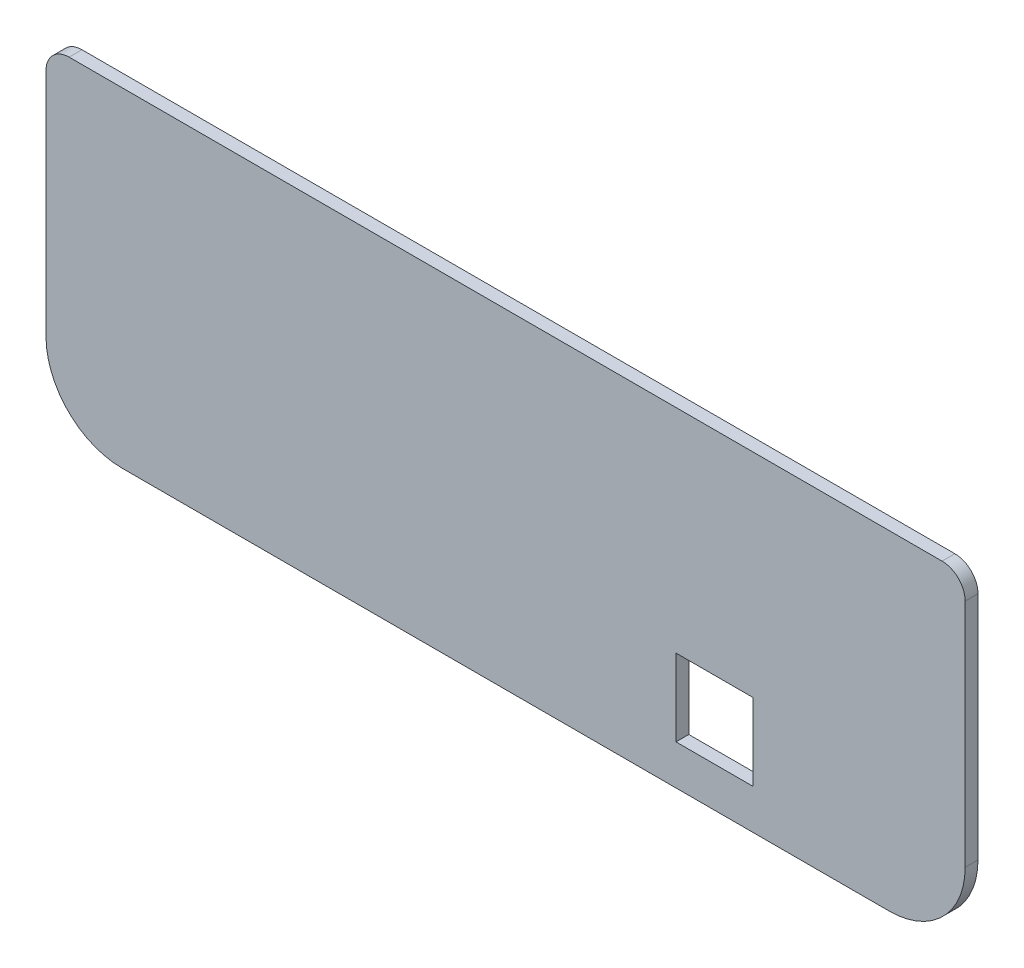
ISO-10303-21;
HEADER;
FILE_DESCRIPTION(('STEP AP214'),'2;1');
FILE_NAME('part.step','',(''),(''),'','','');
FILE_SCHEMA(('AUTOMOTIVE_DESIGN { 1 0 10303 214 1 1 1 1 }'));
ENDSEC;
DATA;
#1=APPLICATION_CONTEXT('core data for automotive mechanical design processes');
#2=APPLICATION_PROTOCOL_DEFINITION('international standard','automotive_design',2000,#1);
#3=PRODUCT_CONTEXT('',#1,'mechanical');
#4=PRODUCT('Part','Part','',(#3));
#5=PRODUCT_RELATED_PRODUCT_CATEGORY('part','',(#4));
#6=PRODUCT_DEFINITION_FORMATION('','',#4);
#7=PRODUCT_DEFINITION_CONTEXT('part definition',#1,'design');
#8=PRODUCT_DEFINITION('design','',#6,#7);
#9=PRODUCT_DEFINITION_SHAPE('','',#8);
#10=(LENGTH_UNIT() NAMED_UNIT(*) SI_UNIT(.MILLI.,.METRE.));
#11=(NAMED_UNIT(*) PLANE_ANGLE_UNIT() SI_UNIT($,.RADIAN.));
#12=(NAMED_UNIT(*) SI_UNIT($,.STERADIAN.) SOLID_ANGLE_UNIT());
#13=UNCERTAINTY_MEASURE_WITH_UNIT(LENGTH_MEASURE(1.E-05),#10,'distance_accuracy_value','');
#14=(GEOMETRIC_REPRESENTATION_CONTEXT(3) GLOBAL_UNCERTAINTY_ASSIGNED_CONTEXT((#13)) GLOBAL_UNIT_ASSIGNED_CONTEXT((#10,
#11,#12)) REPRESENTATION_CONTEXT('',''));
#15=CARTESIAN_POINT('',(0.,0.,0.));
#16=DIRECTION('',(0.,0.,1.));
#17=DIRECTION('',(1.,0.,0.));
#18=AXIS2_PLACEMENT_3D('',#15,#16,#17);
#19=CARTESIAN_POINT('',(4.5,57.73,2.5));
#20=DIRECTION('',(0.,0.,-1.));
#21=DIRECTION('',(-1.,0.,0.));
#22=AXIS2_PLACEMENT_3D('',#19,#20,#21);
#23=CYLINDRICAL_SURFACE('',#22,4.5);
#24=CARTESIAN_POINT('',(4.5,57.73,0.));
#25=DIRECTION('',(0.,0.,1.));
#26=DIRECTION('',(-1.,0.,0.));
#27=AXIS2_PLACEMENT_3D('',#24,#25,#26);
#28=CIRCLE('',#27,4.5);
#29=CARTESIAN_POINT('',(4.50000000000003,62.23,0.));
#30=VERTEX_POINT('',#29);
#31=CARTESIAN_POINT('',(0.,57.73,0.));
#32=VERTEX_POINT('',#31);
#33=EDGE_CURVE('E157',#30,#32,#28,.T.);
#34=ORIENTED_EDGE('',*,*,#33,.T.);
#35=DIRECTION('',(0.,0.,-1.));
#36=VECTOR('',#35,1.);
#37=CARTESIAN_POINT('',(0.,57.73,2.5));
#38=LINE('',#37,#36);
#39=CARTESIAN_POINT('',(0.,57.73,2.5));
#40=VERTEX_POINT('',#39);
#41=EDGE_CURVE('E11',#40,#32,#38,.T.);
#42=ORIENTED_EDGE('',*,*,#41,.F.);
#43=CARTESIAN_POINT('',(4.5,57.73,2.5));
#44=DIRECTION('',(0.,0.,1.));
#45=DIRECTION('',(-1.,0.,0.));
#46=AXIS2_PLACEMENT_3D('',#43,#44,#45);
#47=CIRCLE('',#46,4.5);
#48=CARTESIAN_POINT('',(4.50000000000003,62.23,2.5));
#49=VERTEX_POINT('',#48);
#50=EDGE_CURVE('E158',#49,#40,#47,.T.);
#51=ORIENTED_EDGE('',*,*,#50,.F.);
#52=DIRECTION('',(0.,0.,-1.));
#53=VECTOR('',#52,1.);
#54=CARTESIAN_POINT('',(4.50000000000003,62.23,2.5));
#55=LINE('',#54,#53);
#56=EDGE_CURVE('E176',#49,#30,#55,.T.);
#57=ORIENTED_EDGE('',*,*,#56,.T.);
#58=EDGE_LOOP('',(#34,#42,#51,#57));
#59=FACE_BOUND('',#58,.T.);
#60=ADVANCED_FACE('F32',(#59),#23,.T.);
#61=CARTESIAN_POINT('',(0.,12.8,2.5));
#62=DIRECTION('',(1.,0.,0.));
#63=DIRECTION('',(0.,0.,-1.));
#64=AXIS2_PLACEMENT_3D('',#61,#62,#63);
#65=PLANE('',#64);
#66=DIRECTION('',(0.,-1.,0.));
#67=VECTOR('',#66,1.);
#68=CARTESIAN_POINT('',(0.,12.8,0.));
#69=LINE('',#68,#67);
#70=CARTESIAN_POINT('',(0.,12.8,0.));
#71=VERTEX_POINT('',#70);
#72=EDGE_CURVE('E179',#32,#71,#69,.T.);
#73=ORIENTED_EDGE('',*,*,#72,.T.);
#74=DIRECTION('',(0.,0.,-1.));
#75=VECTOR('',#74,1.);
#76=CARTESIAN_POINT('',(0.,12.8,2.5));
#77=LINE('',#76,#75);
#78=CARTESIAN_POINT('',(0.,12.8,2.5));
#79=VERTEX_POINT('',#78);
#80=EDGE_CURVE('E39',#79,#71,#77,.T.);
#81=ORIENTED_EDGE('',*,*,#80,.F.);
#82=DIRECTION('',(0.,-1.,0.));
#83=VECTOR('',#82,1.);
#84=CARTESIAN_POINT('',(0.,12.8,2.5));
#85=LINE('',#84,#83);
#86=EDGE_CURVE('E161',#40,#79,#85,.T.);
#87=ORIENTED_EDGE('',*,*,#86,.F.);
#88=ORIENTED_EDGE('',*,*,#41,.T.);
#89=EDGE_LOOP('',(#73,#81,#87,#88));
#90=FACE_BOUND('',#89,.T.);
#91=ADVANCED_FACE('F234',(#90),#65,.F.);
#92=CARTESIAN_POINT('',(14.8,12.8,2.5));
#93=DIRECTION('',(0.,0.,-1.));
#94=DIRECTION('',(-1.,0.,0.));
#95=AXIS2_PLACEMENT_3D('',#92,#93,#94);
#96=CYLINDRICAL_SURFACE('',#95,14.8);
#97=CARTESIAN_POINT('',(14.8,12.8,0.));
#98=DIRECTION('',(0.,0.,1.));
#99=DIRECTION('',(-1.,0.,0.));
#100=AXIS2_PLACEMENT_3D('',#97,#98,#99);
#101=CIRCLE('',#100,14.8);
#102=CARTESIAN_POINT('',(14.8,-2.00000000000001,0.));
#103=VERTEX_POINT('',#102);
#104=EDGE_CURVE('E181',#71,#103,#101,.T.);
#105=ORIENTED_EDGE('',*,*,#104,.T.);
#106=DIRECTION('',(0.,0.,-1.));
#107=VECTOR('',#106,1.);
#108=CARTESIAN_POINT('',(14.8,-2.00000000000001,2.5));
#109=LINE('',#108,#107);
#110=CARTESIAN_POINT('',(14.8,-2.00000000000001,2.5));
#111=VERTEX_POINT('',#110);
#112=EDGE_CURVE('E206',#111,#103,#109,.T.);
#113=ORIENTED_EDGE('',*,*,#112,.F.);
#114=CARTESIAN_POINT('',(14.8,12.8,2.5));
#115=DIRECTION('',(0.,0.,1.));
#116=DIRECTION('',(-1.,0.,0.));
#117=AXIS2_PLACEMENT_3D('',#114,#115,#116);
#118=CIRCLE('',#117,14.8);
#119=EDGE_CURVE('E164',#79,#111,#118,.T.);
#120=ORIENTED_EDGE('',*,*,#119,.F.);
#121=ORIENTED_EDGE('',*,*,#80,.T.);
#122=EDGE_LOOP('',(#105,#113,#120,#121));
#123=FACE_BOUND('',#122,.T.);
#124=ADVANCED_FACE('F213',(#123),#96,.T.);
#125=CARTESIAN_POINT('',(14.8,-2.00000000000001,2.5));
#126=DIRECTION('',(0.,1.,0.));
#127=DIRECTION('',(0.,0.,1.));
#128=AXIS2_PLACEMENT_3D('',#125,#126,#127);
#129=PLANE('',#128);
#130=DIRECTION('',(1.,0.,0.));
#131=VECTOR('',#130,1.);
#132=CARTESIAN_POINT('',(14.8,-2.00000000000001,0.));
#133=LINE('',#132,#131);
#134=CARTESIAN_POINT('',(164.37,-2.00000000000001,0.));
#135=VERTEX_POINT('',#134);
#136=EDGE_CURVE('E183',#103,#135,#133,.T.);
#137=ORIENTED_EDGE('',*,*,#136,.T.);
#138=DIRECTION('',(0.,0.,-1.));
#139=VECTOR('',#138,1.);
#140=CARTESIAN_POINT('',(164.37,-2.00000000000001,2.5));
#141=LINE('',#140,#139);
#142=CARTESIAN_POINT('',(164.37,-2.00000000000001,2.5));
#143=VERTEX_POINT('',#142);
#144=EDGE_CURVE('E203',#143,#135,#141,.T.);
#145=ORIENTED_EDGE('',*,*,#144,.F.);
#146=DIRECTION('',(1.,0.,0.));
#147=VECTOR('',#146,1.);
#148=CARTESIAN_POINT('',(14.8,-2.00000000000001,2.5));
#149=LINE('',#148,#147);
#150=EDGE_CURVE('E166',#111,#143,#149,.T.);
#151=ORIENTED_EDGE('',*,*,#150,.F.);
#152=ORIENTED_EDGE('',*,*,#112,.T.);
#153=EDGE_LOOP('',(#137,#145,#151,#152));
#154=FACE_BOUND('',#153,.T.);
#155=ADVANCED_FACE('F222',(#154),#129,.F.);
#156=CARTESIAN_POINT('',(164.37,12.8,2.5));
#157=DIRECTION('',(0.,0.,-1.));
#158=DIRECTION('',(-1.,0.,0.));
#159=AXIS2_PLACEMENT_3D('',#156,#157,#158);
#160=CYLINDRICAL_SURFACE('',#159,14.8);
#161=CARTESIAN_POINT('',(164.37,12.8,0.));
#162=DIRECTION('',(0.,0.,1.));
#163=DIRECTION('',(1.,0.,0.));
#164=AXIS2_PLACEMENT_3D('',#161,#162,#163);
#165=CIRCLE('',#164,14.8);
#166=CARTESIAN_POINT('',(179.17,12.8,0.));
#167=VERTEX_POINT('',#166);
#168=EDGE_CURVE('E185',#135,#167,#165,.T.);
#169=ORIENTED_EDGE('',*,*,#168,.T.);
#170=DIRECTION('',(0.,0.,-1.));
#171=VECTOR('',#170,1.);
#172=CARTESIAN_POINT('',(179.17,12.8,2.5));
#173=LINE('',#172,#171);
#174=CARTESIAN_POINT('',(179.17,12.8,2.5));
#175=VERTEX_POINT('',#174);
#176=EDGE_CURVE('E200',#175,#167,#173,.T.);
#177=ORIENTED_EDGE('',*,*,#176,.F.);
#178=CARTESIAN_POINT('',(164.37,12.8,2.5));
#179=DIRECTION('',(0.,0.,1.));
#180=DIRECTION('',(1.,0.,0.));
#181=AXIS2_PLACEMENT_3D('',#178,#179,#180);
#182=CIRCLE('',#181,14.8);
#183=EDGE_CURVE('E168',#143,#175,#182,.T.);
#184=ORIENTED_EDGE('',*,*,#183,.F.);
#185=ORIENTED_EDGE('',*,*,#144,.T.);
#186=EDGE_LOOP('',(#169,#177,#184,#185));
#187=FACE_BOUND('',#186,.T.);
#188=ADVANCED_FACE('F226',(#187),#160,.T.);
#189=CARTESIAN_POINT('',(179.17,12.8,2.5));
#190=DIRECTION('',(-1.,0.,0.));
#191=DIRECTION('',(0.,0.,1.));
#192=AXIS2_PLACEMENT_3D('',#189,#190,#191);
#193=PLANE('',#192);
#194=DIRECTION('',(0.,1.,0.));
#195=VECTOR('',#194,1.);
#196=CARTESIAN_POINT('',(179.17,12.8,0.));
#197=LINE('',#196,#195);
#198=CARTESIAN_POINT('',(179.17,57.73,0.));
#199=VERTEX_POINT('',#198);
#200=EDGE_CURVE('E187',#167,#199,#197,.T.);
#201=ORIENTED_EDGE('',*,*,#200,.T.);
#202=DIRECTION('',(0.,0.,-1.));
#203=VECTOR('',#202,1.);
#204=CARTESIAN_POINT('',(179.17,57.73,2.5));
#205=LINE('',#204,#203);
#206=CARTESIAN_POINT('',(179.17,57.73,2.5));
#207=VERTEX_POINT('',#206);
#208=EDGE_CURVE('E197',#207,#199,#205,.T.);
#209=ORIENTED_EDGE('',*,*,#208,.F.);
#210=DIRECTION('',(0.,1.,0.));
#211=VECTOR('',#210,1.);
#212=CARTESIAN_POINT('',(179.17,12.8,2.5));
#213=LINE('',#212,#211);
#214=EDGE_CURVE('E170',#175,#207,#213,.T.);
#215=ORIENTED_EDGE('',*,*,#214,.F.);
#216=ORIENTED_EDGE('',*,*,#176,.T.);
#217=EDGE_LOOP('',(#201,#209,#215,#216));
#218=FACE_BOUND('',#217,.T.);
#219=ADVANCED_FACE('F247',(#218),#193,.F.);
#220=CARTESIAN_POINT('',(174.67,57.73,2.5));
#221=DIRECTION('',(0.,0.,-1.));
#222=DIRECTION('',(-1.,0.,0.));
#223=AXIS2_PLACEMENT_3D('',#220,#221,#222);
#224=CYLINDRICAL_SURFACE('',#223,4.50000000000001);
#225=CARTESIAN_POINT('',(174.67,57.73,0.));
#226=DIRECTION('',(0.,0.,1.));
#227=DIRECTION('',(-1.,0.,0.));
#228=AXIS2_PLACEMENT_3D('',#225,#226,#227);
#229=CIRCLE('',#228,4.50000000000001);
#230=CARTESIAN_POINT('',(174.67,62.23,0.));
#231=VERTEX_POINT('',#230);
#232=EDGE_CURVE('E189',#199,#231,#229,.T.);
#233=ORIENTED_EDGE('',*,*,#232,.T.);
#234=DIRECTION('',(0.,0.,-1.));
#235=VECTOR('',#234,1.);
#236=CARTESIAN_POINT('',(174.67,62.23,2.5));
#237=LINE('',#236,#235);
#238=CARTESIAN_POINT('',(174.67,62.23,2.5));
#239=VERTEX_POINT('',#238);
#240=EDGE_CURVE('E194',#239,#231,#237,.T.);
#241=ORIENTED_EDGE('',*,*,#240,.F.);
#242=CARTESIAN_POINT('',(174.67,57.73,2.5));
#243=DIRECTION('',(0.,0.,1.));
#244=DIRECTION('',(-1.,0.,0.));
#245=AXIS2_PLACEMENT_3D('',#242,#243,#244);
#246=CIRCLE('',#245,4.50000000000001);
#247=EDGE_CURVE('E172',#207,#239,#246,.T.);
#248=ORIENTED_EDGE('',*,*,#247,.F.);
#249=ORIENTED_EDGE('',*,*,#208,.T.);
#250=EDGE_LOOP('',(#233,#241,#248,#249));
#251=FACE_BOUND('',#250,.T.);
#252=ADVANCED_FACE('F245',(#251),#224,.T.);
#253=CARTESIAN_POINT('',(4.50000000000003,62.23,2.5));
#254=DIRECTION('',(0.,-1.,0.));
#255=DIRECTION('',(0.,0.,-1.));
#256=AXIS2_PLACEMENT_3D('',#253,#254,#255);
#257=PLANE('',#256);
#258=DIRECTION('',(-1.,0.,0.));
#259=VECTOR('',#258,1.);
#260=CARTESIAN_POINT('',(4.50000000000003,62.23,0.));
#261=LINE('',#260,#259);
#262=EDGE_CURVE('E162',#231,#30,#261,.T.);
#263=ORIENTED_EDGE('',*,*,#262,.T.);
#264=ORIENTED_EDGE('',*,*,#56,.F.);
#265=DIRECTION('',(-1.,0.,0.));
#266=VECTOR('',#265,1.);
#267=CARTESIAN_POINT('',(4.50000000000003,62.23,2.5));
#268=LINE('',#267,#266);
#269=EDGE_CURVE('E174',#239,#49,#268,.T.);
#270=ORIENTED_EDGE('',*,*,#269,.F.);
#271=ORIENTED_EDGE('',*,*,#240,.T.);
#272=EDGE_LOOP('',(#263,#264,#270,#271));
#273=FACE_BOUND('',#272,.T.);
#274=ADVANCED_FACE('F240',(#273),#257,.F.);
#275=CARTESIAN_POINT('',(4.5,57.73,2.5));
#276=DIRECTION('',(0.,0.,-1.));
#277=DIRECTION('',(-1.,0.,0.));
#278=AXIS2_PLACEMENT_3D('',#275,#276,#277);
#279=PLANE('',#278);
#280=DIRECTION('',(1.,0.,0.));
#281=VECTOR('',#280,1.);
#282=CARTESIAN_POINT('',(4.5,20.7801510442996,2.5));
#283=LINE('',#282,#281);
#284=CARTESIAN_POINT('',(122.7949050157,20.7801510442996,2.5));
#285=VERTEX_POINT('',#284);
#286=CARTESIAN_POINT('',(137.7949050157,20.7801510442996,2.5));
#287=VERTEX_POINT('',#286);
#288=EDGE_CURVE('E151',#285,#287,#283,.T.);
#289=ORIENTED_EDGE('',*,*,#288,.T.);
#290=DIRECTION('',(0.,-1.,0.));
#291=VECTOR('',#290,1.);
#292=CARTESIAN_POINT('',(137.7949050157,57.73,2.5));
#293=LINE('',#292,#291);
#294=CARTESIAN_POINT('',(137.7949050157,5.78015104429964,2.5));
#295=VERTEX_POINT('',#294);
#296=EDGE_CURVE('E154',#287,#295,#293,.T.);
#297=ORIENTED_EDGE('',*,*,#296,.T.);
#298=DIRECTION('',(-1.,0.,0.));
#299=VECTOR('',#298,1.);
#300=CARTESIAN_POINT('',(4.5,5.78015104429964,2.5));
#301=LINE('',#300,#299);
#302=CARTESIAN_POINT('',(122.7949050157,5.78015104429964,2.5));
#303=VERTEX_POINT('',#302);
#304=EDGE_CURVE('E146',#295,#303,#301,.T.);
#305=ORIENTED_EDGE('',*,*,#304,.T.);
#306=DIRECTION('',(0.,1.,0.));
#307=VECTOR('',#306,1.);
#308=CARTESIAN_POINT('',(122.7949050157,57.73,2.5));
#309=LINE('',#308,#307);
#310=EDGE_CURVE('E126',#303,#285,#309,.T.);
#311=ORIENTED_EDGE('',*,*,#310,.T.);
#312=EDGE_LOOP('',(#289,#297,#305,#311));
#313=FACE_BOUND('',#312,.T.);
#314=ORIENTED_EDGE('',*,*,#50,.T.);
#315=ORIENTED_EDGE('',*,*,#86,.T.);
#316=ORIENTED_EDGE('',*,*,#119,.T.);
#317=ORIENTED_EDGE('',*,*,#150,.T.);
#318=ORIENTED_EDGE('',*,*,#183,.T.);
#319=ORIENTED_EDGE('',*,*,#214,.T.);
#320=ORIENTED_EDGE('',*,*,#247,.T.);
#321=ORIENTED_EDGE('',*,*,#269,.T.);
#322=EDGE_LOOP('',(#314,#315,#316,#317,#318,#319,#320,#321));
#323=FACE_BOUND('',#322,.T.);
#324=ADVANCED_FACE('F230',(#313,#323),#279,.F.);
#325=CARTESIAN_POINT('',(4.5,57.73,0.));
#326=DIRECTION('',(0.,0.,-1.));
#327=DIRECTION('',(-1.,0.,0.));
#328=AXIS2_PLACEMENT_3D('',#325,#326,#327);
#329=PLANE('',#328);
#330=DIRECTION('',(0.,-1.,0.));
#331=VECTOR('',#330,1.);
#332=CARTESIAN_POINT('',(137.7949050157,5.78015104429964,0.));
#333=LINE('',#332,#331);
#334=CARTESIAN_POINT('',(137.7949050157,20.7801510442996,0.));
#335=VERTEX_POINT('',#334);
#336=CARTESIAN_POINT('',(137.7949050157,5.78015104429964,0.));
#337=VERTEX_POINT('',#336);
#338=EDGE_CURVE('E54',#335,#337,#333,.T.);
#339=ORIENTED_EDGE('',*,*,#338,.F.);
#340=DIRECTION('',(1.,0.,0.));
#341=VECTOR('',#340,1.);
#342=CARTESIAN_POINT('',(137.7949050157,20.7801510442996,0.));
#343=LINE('',#342,#341);
#344=CARTESIAN_POINT('',(122.7949050157,20.7801510442996,0.));
#345=VERTEX_POINT('',#344);
#346=EDGE_CURVE('E139',#345,#335,#343,.T.);
#347=ORIENTED_EDGE('',*,*,#346,.F.);
#348=DIRECTION('',(0.,1.,0.));
#349=VECTOR('',#348,1.);
#350=CARTESIAN_POINT('',(122.7949050157,5.78015104429964,0.));
#351=LINE('',#350,#349);
#352=CARTESIAN_POINT('',(122.7949050157,5.78015104429964,0.));
#353=VERTEX_POINT('',#352);
#354=EDGE_CURVE('E123',#353,#345,#351,.T.);
#355=ORIENTED_EDGE('',*,*,#354,.F.);
#356=DIRECTION('',(-1.,0.,0.));
#357=VECTOR('',#356,1.);
#358=CARTESIAN_POINT('',(137.7949050157,5.78015104429964,0.));
#359=LINE('',#358,#357);
#360=EDGE_CURVE('E132',#337,#353,#359,.T.);
#361=ORIENTED_EDGE('',*,*,#360,.F.);
#362=EDGE_LOOP('',(#339,#347,#355,#361));
#363=FACE_BOUND('',#362,.T.);
#364=ORIENTED_EDGE('',*,*,#33,.F.);
#365=ORIENTED_EDGE('',*,*,#262,.F.);
#366=ORIENTED_EDGE('',*,*,#232,.F.);
#367=ORIENTED_EDGE('',*,*,#200,.F.);
#368=ORIENTED_EDGE('',*,*,#168,.F.);
#369=ORIENTED_EDGE('',*,*,#136,.F.);
#370=ORIENTED_EDGE('',*,*,#104,.F.);
#371=ORIENTED_EDGE('',*,*,#72,.F.);
#372=EDGE_LOOP('',(#364,#365,#366,#367,#368,#369,#370,#371));
#373=FACE_BOUND('',#372,.T.);
#374=ADVANCED_FACE('F136',(#363,#373),#329,.T.);
#375=CARTESIAN_POINT('',(137.7949050157,5.78015104429964,10.));
#376=DIRECTION('',(1.,0.,0.));
#377=DIRECTION('',(0.,0.,-1.));
#378=AXIS2_PLACEMENT_3D('',#375,#376,#377);
#379=PLANE('',#378);
#380=DIRECTION('',(0.,0.,-1.));
#381=VECTOR('',#380,1.);
#382=CARTESIAN_POINT('',(137.7949050157,20.7801510442996,10.));
#383=LINE('',#382,#381);
#384=EDGE_CURVE('E144',#287,#335,#383,.T.);
#385=ORIENTED_EDGE('',*,*,#384,.T.);
#386=ORIENTED_EDGE('',*,*,#338,.T.);
#387=DIRECTION('',(0.,0.,-1.));
#388=VECTOR('',#387,1.);
#389=CARTESIAN_POINT('',(137.7949050157,5.78015104429964,10.));
#390=LINE('',#389,#388);
#391=EDGE_CURVE('E129',#295,#337,#390,.T.);
#392=ORIENTED_EDGE('',*,*,#391,.F.);
#393=ORIENTED_EDGE('',*,*,#296,.F.);
#394=EDGE_LOOP('',(#385,#386,#392,#393));
#395=FACE_BOUND('',#394,.T.);
#396=ADVANCED_FACE('F310',(#395),#379,.F.);
#397=CARTESIAN_POINT('',(137.7949050157,20.7801510442996,10.));
#398=DIRECTION('',(0.,1.,0.));
#399=DIRECTION('',(0.,0.,1.));
#400=AXIS2_PLACEMENT_3D('',#397,#398,#399);
#401=PLANE('',#400);
#402=DIRECTION('',(0.,0.,-1.));
#403=VECTOR('',#402,1.);
#404=CARTESIAN_POINT('',(122.7949050157,20.7801510442996,10.));
#405=LINE('',#404,#403);
#406=EDGE_CURVE('E128',#285,#345,#405,.T.);
#407=ORIENTED_EDGE('',*,*,#406,.T.);
#408=ORIENTED_EDGE('',*,*,#346,.T.);
#409=ORIENTED_EDGE('',*,*,#384,.F.);
#410=ORIENTED_EDGE('',*,*,#288,.F.);
#411=EDGE_LOOP('',(#407,#408,#409,#410));
#412=FACE_BOUND('',#411,.T.);
#413=ADVANCED_FACE('F319',(#412),#401,.F.);
#414=CARTESIAN_POINT('',(122.7949050157,5.78015104429964,10.));
#415=DIRECTION('',(-1.,0.,0.));
#416=DIRECTION('',(0.,0.,1.));
#417=AXIS2_PLACEMENT_3D('',#414,#415,#416);
#418=PLANE('',#417);
#419=DIRECTION('',(0.,0.,-1.));
#420=VECTOR('',#419,1.);
#421=CARTESIAN_POINT('',(122.7949050157,5.78015104429964,10.));
#422=LINE('',#421,#420);
#423=EDGE_CURVE('E46',#303,#353,#422,.T.);
#424=ORIENTED_EDGE('',*,*,#423,.T.);
#425=ORIENTED_EDGE('',*,*,#354,.T.);
#426=ORIENTED_EDGE('',*,*,#406,.F.);
#427=ORIENTED_EDGE('',*,*,#310,.F.);
#428=EDGE_LOOP('',(#424,#425,#426,#427));
#429=FACE_BOUND('',#428,.T.);
#430=ADVANCED_FACE('F120',(#429),#418,.F.);
#431=CARTESIAN_POINT('',(137.7949050157,5.78015104429964,10.));
#432=DIRECTION('',(0.,-1.,0.));
#433=DIRECTION('',(0.,0.,-1.));
#434=AXIS2_PLACEMENT_3D('',#431,#432,#433);
#435=PLANE('',#434);
#436=ORIENTED_EDGE('',*,*,#391,.T.);
#437=ORIENTED_EDGE('',*,*,#360,.T.);
#438=ORIENTED_EDGE('',*,*,#423,.F.);
#439=ORIENTED_EDGE('',*,*,#304,.F.);
#440=EDGE_LOOP('',(#436,#437,#438,#439));
#441=FACE_BOUND('',#440,.T.);
#442=ADVANCED_FACE('F133',(#441),#435,.F.);
#443=CLOSED_SHELL('',(#60,#91,#124,#155,#188,#219,#252,#274,#324,#374,#396,#413,#430,#442));
#444=MANIFOLD_SOLID_BREP('B2',#443);
#445=ADVANCED_BREP_SHAPE_REPRESENTATION('',(#18,#444),#14);
#446=SHAPE_DEFINITION_REPRESENTATION(#9,#445);
ENDSEC;
END-ISO-10303-21;
